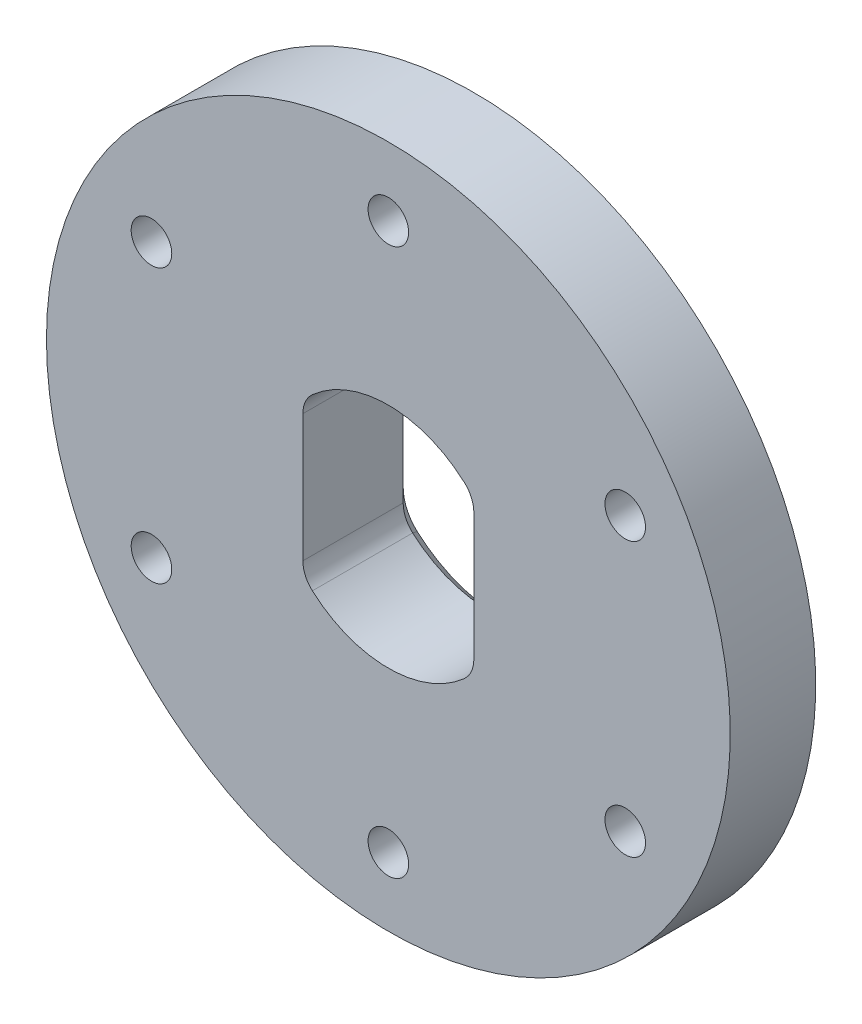
ISO-10303-21;
HEADER;
FILE_DESCRIPTION(('STEP AP214'),'2;1');
FILE_NAME('part.step','',(''),(''),'','','');
FILE_SCHEMA(('AUTOMOTIVE_DESIGN { 1 0 10303 214 1 1 1 1 }'));
ENDSEC;
DATA;
#1=APPLICATION_CONTEXT('core data for automotive mechanical design processes');
#2=APPLICATION_PROTOCOL_DEFINITION('international standard','automotive_design',2000,#1);
#3=PRODUCT_CONTEXT('',#1,'mechanical');
#4=PRODUCT('Part','Part','',(#3));
#5=PRODUCT_RELATED_PRODUCT_CATEGORY('part','',(#4));
#6=PRODUCT_DEFINITION_FORMATION('','',#4);
#7=PRODUCT_DEFINITION_CONTEXT('part definition',#1,'design');
#8=PRODUCT_DEFINITION('design','',#6,#7);
#9=PRODUCT_DEFINITION_SHAPE('','',#8);
#10=(LENGTH_UNIT() NAMED_UNIT(*) SI_UNIT(.MILLI.,.METRE.));
#11=(NAMED_UNIT(*) PLANE_ANGLE_UNIT() SI_UNIT($,.RADIAN.));
#12=(NAMED_UNIT(*) SI_UNIT($,.STERADIAN.) SOLID_ANGLE_UNIT());
#13=UNCERTAINTY_MEASURE_WITH_UNIT(LENGTH_MEASURE(1.E-05),#10,'distance_accuracy_value','');
#14=(GEOMETRIC_REPRESENTATION_CONTEXT(3) GLOBAL_UNCERTAINTY_ASSIGNED_CONTEXT((#13)) GLOBAL_UNIT_ASSIGNED_CONTEXT((#10,
#11,#12)) REPRESENTATION_CONTEXT('',''));
#15=CARTESIAN_POINT('',(0.,0.,0.));
#16=DIRECTION('',(0.,0.,1.));
#17=DIRECTION('',(1.,0.,0.));
#18=AXIS2_PLACEMENT_3D('',#15,#16,#17);
#19=CARTESIAN_POINT('',(0.,0.,0.));
#20=DIRECTION('',(0.,0.,1.));
#21=DIRECTION('',(1.,0.,0.));
#22=AXIS2_PLACEMENT_3D('',#19,#20,#21);
#23=PLANE('',#22);
#24=CARTESIAN_POINT('',(13.1982271536748,7.62000000000015,0.));
#25=DIRECTION('',(0.,0.,1.));
#26=DIRECTION('',(1.,0.,0.));
#27=AXIS2_PLACEMENT_3D('',#24,#25,#26);
#28=CIRCLE('',#27,1.13029999999999);
#29=CARTESIAN_POINT('',(14.3285271536747,7.62000000000015,0.));
#30=VERTEX_POINT('',#29);
#31=EDGE_CURVE('E233',#30,#30,#28,.T.);
#32=ORIENTED_EDGE('',*,*,#31,.T.);
#33=EDGE_LOOP('',(#32));
#34=FACE_BOUND('',#33,.T.);
#35=CARTESIAN_POINT('',(13.1982271536749,-7.61999999999988,0.));
#36=DIRECTION('',(0.,0.,1.));
#37=DIRECTION('',(1.,0.,0.));
#38=AXIS2_PLACEMENT_3D('',#35,#36,#37);
#39=CIRCLE('',#38,1.13029999999999);
#40=CARTESIAN_POINT('',(14.3285271536749,-7.61999999999988,0.));
#41=VERTEX_POINT('',#40);
#42=EDGE_CURVE('E243',#41,#41,#39,.T.);
#43=ORIENTED_EDGE('',*,*,#42,.T.);
#44=EDGE_LOOP('',(#43));
#45=FACE_BOUND('',#44,.T.);
#46=CARTESIAN_POINT('',(0.,-15.24,0.));
#47=DIRECTION('',(0.,0.,1.));
#48=DIRECTION('',(1.,0.,0.));
#49=AXIS2_PLACEMENT_3D('',#46,#47,#48);
#50=CIRCLE('',#49,1.13029999999999);
#51=CARTESIAN_POINT('',(1.13029999999999,-15.24,0.));
#52=VERTEX_POINT('',#51);
#53=EDGE_CURVE('E249',#52,#52,#50,.T.);
#54=ORIENTED_EDGE('',*,*,#53,.T.);
#55=EDGE_LOOP('',(#54));
#56=FACE_BOUND('',#55,.T.);
#57=CARTESIAN_POINT('',(-13.1982271536748,-7.62000000000006,0.));
#58=DIRECTION('',(0.,0.,1.));
#59=DIRECTION('',(1.,0.,0.));
#60=AXIS2_PLACEMENT_3D('',#57,#58,#59);
#61=CIRCLE('',#60,1.13029999999999);
#62=CARTESIAN_POINT('',(-12.0679271536748,-7.62000000000006,0.));
#63=VERTEX_POINT('',#62);
#64=EDGE_CURVE('E255',#63,#63,#61,.T.);
#65=ORIENTED_EDGE('',*,*,#64,.T.);
#66=EDGE_LOOP('',(#65));
#67=FACE_BOUND('',#66,.T.);
#68=CARTESIAN_POINT('',(-13.1982271536749,7.61999999999997,0.));
#69=DIRECTION('',(0.,0.,1.));
#70=DIRECTION('',(1.,0.,0.));
#71=AXIS2_PLACEMENT_3D('',#68,#69,#70);
#72=CIRCLE('',#71,1.13029999999999);
#73=CARTESIAN_POINT('',(-12.0679271536749,7.61999999999997,0.));
#74=VERTEX_POINT('',#73);
#75=EDGE_CURVE('E261',#74,#74,#72,.T.);
#76=ORIENTED_EDGE('',*,*,#75,.T.);
#77=EDGE_LOOP('',(#76));
#78=FACE_BOUND('',#77,.T.);
#79=CARTESIAN_POINT('',(0.,15.24,0.));
#80=DIRECTION('',(0.,0.,1.));
#81=DIRECTION('',(1.,0.,0.));
#82=AXIS2_PLACEMENT_3D('',#79,#80,#81);
#83=CIRCLE('',#82,1.13029999999999);
#84=CARTESIAN_POINT('',(1.13029999999999,15.24,0.));
#85=VERTEX_POINT('',#84);
#86=EDGE_CURVE('E267',#85,#85,#83,.T.);
#87=ORIENTED_EDGE('',*,*,#86,.T.);
#88=EDGE_LOOP('',(#87));
#89=FACE_BOUND('',#88,.T.);
#90=CARTESIAN_POINT('',(0.,0.,0.));
#91=DIRECTION('',(0.,0.,1.));
#92=DIRECTION('',(1.,0.,0.));
#93=AXIS2_PLACEMENT_3D('',#90,#91,#92);
#94=CIRCLE('',#93,12.7);
#95=CARTESIAN_POINT('',(12.7,0.,0.));
#96=VERTEX_POINT('',#95);
#97=EDGE_CURVE('E159',#96,#96,#94,.T.);
#98=ORIENTED_EDGE('',*,*,#97,.T.);
#99=EDGE_LOOP('',(#98));
#100=FACE_BOUND('',#99,.T.);
#101=CARTESIAN_POINT('',(0.,0.,0.));
#102=DIRECTION('',(0.,0.,1.));
#103=DIRECTION('',(1.,0.,0.));
#104=AXIS2_PLACEMENT_3D('',#101,#102,#103);
#105=CIRCLE('',#104,19.05);
#106=CARTESIAN_POINT('',(-19.05,0.,0.));
#107=VERTEX_POINT('',#106);
#108=EDGE_CURVE('E279',#107,#107,#105,.T.);
#109=ORIENTED_EDGE('',*,*,#108,.F.);
#110=EDGE_LOOP('',(#109));
#111=FACE_BOUND('',#110,.T.);
#112=ADVANCED_FACE('F37',(#34,#45,#56,#67,#78,#89,#100,#111),#23,.F.);
#113=CARTESIAN_POINT('',(0.,0.,4.7625));
#114=DIRECTION('',(0.,0.,-1.));
#115=DIRECTION('',(-1.,0.,0.));
#116=AXIS2_PLACEMENT_3D('',#113,#114,#115);
#117=CYLINDRICAL_SURFACE('',#116,19.05);
#118=CARTESIAN_POINT('',(0.,0.,4.7625));
#119=DIRECTION('',(0.,0.,1.));
#120=DIRECTION('',(1.,0.,0.));
#121=AXIS2_PLACEMENT_3D('',#118,#119,#120);
#122=CIRCLE('',#121,19.05);
#123=CARTESIAN_POINT('',(-19.05,0.,4.7625));
#124=VERTEX_POINT('',#123);
#125=EDGE_CURVE('E280',#124,#124,#122,.T.);
#126=CARTESIAN_POINT('',(-19.05,0.,4.7625));
#127=CARTESIAN_POINT('',(-19.05,0.,4.712890625));
#128=CARTESIAN_POINT('',(-19.05,0.,4.66328125));
#129=CARTESIAN_POINT('',(-19.05,0.,4.5640625));
#130=CARTESIAN_POINT('',(-19.05,0.,4.514453125));
#131=CARTESIAN_POINT('',(-19.05,0.,4.415234375));
#132=CARTESIAN_POINT('',(-19.05,0.,4.365625));
#133=CARTESIAN_POINT('',(-19.05,0.,4.26640625));
#134=CARTESIAN_POINT('',(-19.05,0.,4.216796875));
#135=CARTESIAN_POINT('',(-19.05,0.,4.117578125));
#136=CARTESIAN_POINT('',(-19.05,0.,4.06796875));
#137=CARTESIAN_POINT('',(-19.05,0.,3.96875));
#138=CARTESIAN_POINT('',(-19.05,0.,3.919140625));
#139=CARTESIAN_POINT('',(-19.05,0.,3.819921875));
#140=CARTESIAN_POINT('',(-19.05,0.,3.7703125));
#141=CARTESIAN_POINT('',(-19.05,0.,3.67109375));
#142=CARTESIAN_POINT('',(-19.05,0.,3.621484375));
#143=CARTESIAN_POINT('',(-19.05,0.,3.522265625));
#144=CARTESIAN_POINT('',(-19.05,0.,3.47265625));
#145=CARTESIAN_POINT('',(-19.05,0.,3.3734375));
#146=CARTESIAN_POINT('',(-19.05,0.,3.323828125));
#147=CARTESIAN_POINT('',(-19.05,0.,3.224609375));
#148=CARTESIAN_POINT('',(-19.05,0.,3.175));
#149=CARTESIAN_POINT('',(-19.05,0.,3.07578125));
#150=CARTESIAN_POINT('',(-19.05,0.,3.026171875));
#151=CARTESIAN_POINT('',(-19.05,0.,2.926953125));
#152=CARTESIAN_POINT('',(-19.05,0.,2.87734375));
#153=CARTESIAN_POINT('',(-19.05,0.,2.778125));
#154=CARTESIAN_POINT('',(-19.05,0.,2.728515625));
#155=CARTESIAN_POINT('',(-19.05,0.,2.629296875));
#156=CARTESIAN_POINT('',(-19.05,0.,2.5796875));
#157=CARTESIAN_POINT('',(-19.05,0.,2.48046875));
#158=CARTESIAN_POINT('',(-19.05,0.,2.430859375));
#159=CARTESIAN_POINT('',(-19.05,0.,2.331640625));
#160=CARTESIAN_POINT('',(-19.05,0.,2.28203125));
#161=CARTESIAN_POINT('',(-19.05,0.,2.1828125));
#162=CARTESIAN_POINT('',(-19.05,0.,2.133203125));
#163=CARTESIAN_POINT('',(-19.05,0.,2.033984375));
#164=CARTESIAN_POINT('',(-19.05,0.,1.984375));
#165=CARTESIAN_POINT('',(-19.05,0.,1.88515625));
#166=CARTESIAN_POINT('',(-19.05,0.,1.835546875));
#167=CARTESIAN_POINT('',(-19.05,0.,1.736328125));
#168=CARTESIAN_POINT('',(-19.05,0.,1.68671875));
#169=CARTESIAN_POINT('',(-19.05,0.,1.5875));
#170=CARTESIAN_POINT('',(-19.05,0.,1.537890625));
#171=CARTESIAN_POINT('',(-19.05,0.,1.438671875));
#172=CARTESIAN_POINT('',(-19.05,0.,1.3890625));
#173=CARTESIAN_POINT('',(-19.05,0.,1.28984375));
#174=CARTESIAN_POINT('',(-19.05,0.,1.240234375));
#175=CARTESIAN_POINT('',(-19.05,0.,1.141015625));
#176=CARTESIAN_POINT('',(-19.05,0.,1.09140625));
#177=CARTESIAN_POINT('',(-19.05,0.,0.992187499999999));
#178=CARTESIAN_POINT('',(-19.05,0.,0.942578124999999));
#179=CARTESIAN_POINT('',(-19.05,0.,0.843359375));
#180=CARTESIAN_POINT('',(-19.05,0.,0.79375));
#181=CARTESIAN_POINT('',(-19.05,0.,0.69453125));
#182=CARTESIAN_POINT('',(-19.05,0.,0.644921875));
#183=CARTESIAN_POINT('',(-19.05,0.,0.545703125));
#184=CARTESIAN_POINT('',(-19.05,0.,0.49609375));
#185=CARTESIAN_POINT('',(-19.05,0.,0.396875));
#186=CARTESIAN_POINT('',(-19.05,0.,0.347265625));
#187=CARTESIAN_POINT('',(-19.05,0.,0.248046875));
#188=CARTESIAN_POINT('',(-19.05,0.,0.1984375));
#189=CARTESIAN_POINT('',(-19.05,0.,0.09921875));
#190=CARTESIAN_POINT('',(-19.05,0.,0.049609375));
#191=CARTESIAN_POINT('',(-19.05,0.,0.));
#192=B_SPLINE_CURVE_WITH_KNOTS('',3,(#126,#127,#128,#129,#130,#131,#132,#133,#134,#135,#136,
#137,#138,#139,#140,#141,#142,#143,#144,#145,#146,#147,#148,#149,#150,#151,#152,#153,#154,#155,
#156,#157,#158,#159,#160,#161,#162,#163,#164,#165,#166,#167,#168,#169,#170,#171,#172,#173,#174,
#175,#176,#177,#178,#179,#180,#181,#182,#183,#184,#185,#186,#187,#188,#189,#190,#191),
.UNSPECIFIED.,.F.,.F.,(4,2,2,2,2,2,2,2,2,2,2,2,2,2,2,2,2,2,2,2,2,2,2,2,2,2,2,2,2,2,2,2,4),(0.,
0.148828125,0.29765625,0.446484375,0.5953125,0.744140625,0.892968750000001,1.041796875,1.190625,
1.339453125,1.48828125,1.637109375,1.7859375,1.934765625,2.08359375,2.232421875,2.38125,
2.530078125,2.67890625,2.827734375,2.9765625,3.125390625,3.27421875,3.423046875,3.571875,
3.720703125,3.86953125,4.018359375,4.1671875,4.316015625,4.46484375,4.613671875,4.7625),.UNSPECIFIED.);
#193=EDGE_CURVE('BSEAM305',#124,#107,#192,.T.);
#194=ORIENTED_EDGE('',*,*,#125,.F.);
#195=ORIENTED_EDGE('',*,*,#108,.T.);
#196=ORIENTED_EDGE('',*,*,#193,.T.);
#197=ORIENTED_EDGE('',*,*,#193,.F.);
#198=EDGE_LOOP('',(#194,#196,#195,#197));
#199=FACE_BOUND('',#198,.T.);
#200=ADVANCED_FACE('F305',(#199),#117,.T.);
#201=CARTESIAN_POINT('',(0.,0.,4.7625));
#202=DIRECTION('',(0.,0.,1.));
#203=DIRECTION('',(1.,0.,0.));
#204=AXIS2_PLACEMENT_3D('',#201,#202,#203);
#205=PLANE('',#204);
#206=CARTESIAN_POINT('',(13.1982271536748,7.62000000000015,4.7625));
#207=DIRECTION('',(0.,0.,1.));
#208=DIRECTION('',(1.,0.,0.));
#209=AXIS2_PLACEMENT_3D('',#206,#207,#208);
#210=CIRCLE('',#209,1.13029999999999);
#211=CARTESIAN_POINT('',(14.3285271536747,7.62000000000015,4.7625));
#212=VERTEX_POINT('',#211);
#213=EDGE_CURVE('E227',#212,#212,#210,.T.);
#214=ORIENTED_EDGE('',*,*,#213,.F.);
#215=EDGE_LOOP('',(#214));
#216=FACE_BOUND('',#215,.T.);
#217=CARTESIAN_POINT('',(13.1982271536749,-7.61999999999988,4.7625));
#218=DIRECTION('',(0.,0.,1.));
#219=DIRECTION('',(1.,0.,0.));
#220=AXIS2_PLACEMENT_3D('',#217,#218,#219);
#221=CIRCLE('',#220,1.13029999999999);
#222=CARTESIAN_POINT('',(14.3285271536749,-7.61999999999988,4.7625));
#223=VERTEX_POINT('',#222);
#224=EDGE_CURVE('E238',#223,#223,#221,.T.);
#225=ORIENTED_EDGE('',*,*,#224,.F.);
#226=EDGE_LOOP('',(#225));
#227=FACE_BOUND('',#226,.T.);
#228=CARTESIAN_POINT('',(0.,-15.24,4.7625));
#229=DIRECTION('',(0.,0.,1.));
#230=DIRECTION('',(1.,0.,0.));
#231=AXIS2_PLACEMENT_3D('',#228,#229,#230);
#232=CIRCLE('',#231,1.13029999999999);
#233=CARTESIAN_POINT('',(1.13029999999999,-15.24,4.7625));
#234=VERTEX_POINT('',#233);
#235=EDGE_CURVE('E246',#234,#234,#232,.T.);
#236=ORIENTED_EDGE('',*,*,#235,.F.);
#237=EDGE_LOOP('',(#236));
#238=FACE_BOUND('',#237,.T.);
#239=CARTESIAN_POINT('',(-13.1982271536748,-7.62000000000006,4.7625));
#240=DIRECTION('',(0.,0.,1.));
#241=DIRECTION('',(1.,0.,0.));
#242=AXIS2_PLACEMENT_3D('',#239,#240,#241);
#243=CIRCLE('',#242,1.13029999999999);
#244=CARTESIAN_POINT('',(-12.0679271536748,-7.62000000000006,4.7625));
#245=VERTEX_POINT('',#244);
#246=EDGE_CURVE('E252',#245,#245,#243,.T.);
#247=ORIENTED_EDGE('',*,*,#246,.F.);
#248=EDGE_LOOP('',(#247));
#249=FACE_BOUND('',#248,.T.);
#250=CARTESIAN_POINT('',(-13.1982271536749,7.61999999999997,4.7625));
#251=DIRECTION('',(0.,0.,1.));
#252=DIRECTION('',(1.,0.,0.));
#253=AXIS2_PLACEMENT_3D('',#250,#251,#252);
#254=CIRCLE('',#253,1.13029999999999);
#255=CARTESIAN_POINT('',(-12.0679271536749,7.61999999999997,4.7625));
#256=VERTEX_POINT('',#255);
#257=EDGE_CURVE('E258',#256,#256,#254,.T.);
#258=ORIENTED_EDGE('',*,*,#257,.F.);
#259=EDGE_LOOP('',(#258));
#260=FACE_BOUND('',#259,.T.);
#261=CARTESIAN_POINT('',(0.,15.24,4.7625));
#262=DIRECTION('',(0.,0.,1.));
#263=DIRECTION('',(1.,0.,0.));
#264=AXIS2_PLACEMENT_3D('',#261,#262,#263);
#265=CIRCLE('',#264,1.13029999999999);
#266=CARTESIAN_POINT('',(1.13029999999999,15.24,4.7625));
#267=VERTEX_POINT('',#266);
#268=EDGE_CURVE('E264',#267,#267,#265,.T.);
#269=ORIENTED_EDGE('',*,*,#268,.F.);
#270=EDGE_LOOP('',(#269));
#271=FACE_BOUND('',#270,.T.);
#272=DIRECTION('',(0.,1.,0.));
#273=VECTOR('',#272,1.);
#274=CARTESIAN_POINT('',(-4.7625,4.20013020631504,4.7625));
#275=LINE('',#274,#273);
#276=CARTESIAN_POINT('',(-4.7625,-3.54975791428091,4.7625));
#277=VERTEX_POINT('',#276);
#278=CARTESIAN_POINT('',(-4.7625,3.54975791428092,4.7625));
#279=VERTEX_POINT('',#278);
#280=EDGE_CURVE('E133',#277,#279,#275,.T.);
#281=ORIENTED_EDGE('',*,*,#280,.T.);
#282=CARTESIAN_POINT('',(-3.175,3.54975791428092,4.7625));
#283=DIRECTION('',(0.,0.,1.));
#284=DIRECTION('',(1.,0.,0.));
#285=AXIS2_PLACEMENT_3D('',#282,#283,#284);
#286=CIRCLE('',#285,1.5875);
#287=CARTESIAN_POINT('',(-4.23333333333333,4.73301055237455,4.7625));
#288=VERTEX_POINT('',#287);
#289=EDGE_CURVE('E173',#279,#288,#286,.F.);
#290=ORIENTED_EDGE('',*,*,#289,.T.);
#291=CARTESIAN_POINT('',(0.,0.,4.7625));
#292=DIRECTION('',(0.,0.,-1.));
#293=DIRECTION('',(-1.,0.,0.));
#294=AXIS2_PLACEMENT_3D('',#291,#292,#293);
#295=CIRCLE('',#294,6.35);
#296=CARTESIAN_POINT('',(4.23333333333333,4.73301055237456,4.7625));
#297=VERTEX_POINT('',#296);
#298=EDGE_CURVE('E270',#288,#297,#295,.T.);
#299=ORIENTED_EDGE('',*,*,#298,.T.);
#300=CARTESIAN_POINT('',(3.175,3.54975791428092,4.7625));
#301=DIRECTION('',(0.,0.,1.));
#302=DIRECTION('',(1.,0.,0.));
#303=AXIS2_PLACEMENT_3D('',#300,#301,#302);
#304=CIRCLE('',#303,1.5875);
#305=CARTESIAN_POINT('',(4.7625,3.54975791428092,4.7625));
#306=VERTEX_POINT('',#305);
#307=EDGE_CURVE('E175',#297,#306,#304,.F.);
#308=ORIENTED_EDGE('',*,*,#307,.T.);
#309=DIRECTION('',(0.,-1.,0.));
#310=VECTOR('',#309,1.);
#311=CARTESIAN_POINT('',(4.7625,4.20013020631504,4.7625));
#312=LINE('',#311,#310);
#313=CARTESIAN_POINT('',(4.7625,-3.54975791428092,4.7625));
#314=VERTEX_POINT('',#313);
#315=EDGE_CURVE('E273',#306,#314,#312,.T.);
#316=ORIENTED_EDGE('',*,*,#315,.T.);
#317=CARTESIAN_POINT('',(3.175,-3.54975791428092,4.7625));
#318=DIRECTION('',(0.,0.,1.));
#319=DIRECTION('',(1.,0.,0.));
#320=AXIS2_PLACEMENT_3D('',#317,#318,#319);
#321=CIRCLE('',#320,1.5875);
#322=CARTESIAN_POINT('',(4.23333333333333,-4.73301055237456,4.7625));
#323=VERTEX_POINT('',#322);
#324=EDGE_CURVE('E140',#314,#323,#321,.F.);
#325=ORIENTED_EDGE('',*,*,#324,.T.);
#326=CARTESIAN_POINT('',(0.,0.,4.7625));
#327=DIRECTION('',(0.,0.,-1.));
#328=DIRECTION('',(-1.,0.,0.));
#329=AXIS2_PLACEMENT_3D('',#326,#327,#328);
#330=CIRCLE('',#329,6.35);
#331=CARTESIAN_POINT('',(-4.23333333333333,-4.73301055237455,4.7625));
#332=VERTEX_POINT('',#331);
#333=EDGE_CURVE('E136',#323,#332,#330,.T.);
#334=ORIENTED_EDGE('',*,*,#333,.T.);
#335=CARTESIAN_POINT('',(-3.175,-3.54975791428092,4.7625));
#336=DIRECTION('',(0.,0.,1.));
#337=DIRECTION('',(1.,0.,0.));
#338=AXIS2_PLACEMENT_3D('',#335,#336,#337);
#339=CIRCLE('',#338,1.5875);
#340=EDGE_CURVE('E129',#332,#277,#339,.F.);
#341=ORIENTED_EDGE('',*,*,#340,.T.);
#342=EDGE_LOOP('',(#281,#290,#299,#308,#316,#325,#334,#341));
#343=FACE_BOUND('',#342,.T.);
#344=ORIENTED_EDGE('',*,*,#125,.T.);
#345=EDGE_LOOP('',(#344));
#346=FACE_BOUND('',#345,.T.);
#347=ADVANCED_FACE('F131',(#216,#227,#238,#249,#260,#271,#343,#346),#205,.T.);
#348=CARTESIAN_POINT('',(0.,0.,-1.5875));
#349=DIRECTION('',(0.,0.,-1.));
#350=DIRECTION('',(-1.,0.,0.));
#351=AXIS2_PLACEMENT_3D('',#348,#349,#350);
#352=PLANE('',#351);
#353=CARTESIAN_POINT('',(-3.175,-3.54975791428092,-1.5875));
#354=DIRECTION('',(0.,0.,-1.));
#355=DIRECTION('',(-1.,0.,0.));
#356=AXIS2_PLACEMENT_3D('',#353,#354,#355);
#357=CIRCLE('',#356,2.34950000000001);
#358=CARTESIAN_POINT('',(-5.52450000000001,-3.54975791428092,-1.5875));
#359=VERTEX_POINT('',#358);
#360=CARTESIAN_POINT('',(-4.74133333333334,-5.30097181865951,-1.5875));
#361=VERTEX_POINT('',#360);
#362=EDGE_CURVE('E192',#359,#361,#357,.F.);
#363=ORIENTED_EDGE('',*,*,#362,.T.);
#364=CARTESIAN_POINT('',(0.,0.,-1.5875));
#365=DIRECTION('',(0.,0.,-1.));
#366=DIRECTION('',(-1.,0.,0.));
#367=AXIS2_PLACEMENT_3D('',#364,#365,#366);
#368=CIRCLE('',#367,7.11200000000001);
#369=CARTESIAN_POINT('',(4.74133333333334,-5.30097181865951,-1.5875));
#370=VERTEX_POINT('',#369);
#371=EDGE_CURVE('E194',#361,#370,#368,.F.);
#372=ORIENTED_EDGE('',*,*,#371,.T.);
#373=CARTESIAN_POINT('',(3.175,-3.54975791428092,-1.5875));
#374=DIRECTION('',(0.,0.,-1.));
#375=DIRECTION('',(-1.,0.,0.));
#376=AXIS2_PLACEMENT_3D('',#373,#374,#375);
#377=CIRCLE('',#376,2.34950000000001);
#378=CARTESIAN_POINT('',(5.52450000000001,-3.54975791428092,-1.5875));
#379=VERTEX_POINT('',#378);
#380=EDGE_CURVE('E190',#370,#379,#377,.F.);
#381=ORIENTED_EDGE('',*,*,#380,.T.);
#382=DIRECTION('',(0.,1.,0.));
#383=VECTOR('',#382,1.);
#384=CARTESIAN_POINT('',(5.52450000000001,3.54975791428092,-1.5875));
#385=LINE('',#384,#383);
#386=CARTESIAN_POINT('',(5.52450000000001,3.54975791428092,-1.5875));
#387=VERTEX_POINT('',#386);
#388=EDGE_CURVE('E186',#379,#387,#385,.T.);
#389=ORIENTED_EDGE('',*,*,#388,.T.);
#390=CARTESIAN_POINT('',(3.175,3.54975791428092,-1.5875));
#391=DIRECTION('',(0.,0.,-1.));
#392=DIRECTION('',(-1.,0.,0.));
#393=AXIS2_PLACEMENT_3D('',#390,#391,#392);
#394=CIRCLE('',#393,2.34950000000001);
#395=CARTESIAN_POINT('',(4.74133333333334,5.30097181865951,-1.5875));
#396=VERTEX_POINT('',#395);
#397=EDGE_CURVE('E182',#387,#396,#394,.F.);
#398=ORIENTED_EDGE('',*,*,#397,.T.);
#399=CARTESIAN_POINT('',(0.,0.,-1.5875));
#400=DIRECTION('',(0.,0.,-1.));
#401=DIRECTION('',(-1.,0.,0.));
#402=AXIS2_PLACEMENT_3D('',#399,#400,#401);
#403=CIRCLE('',#402,7.11200000000001);
#404=CARTESIAN_POINT('',(-4.74133333333334,5.30097181865951,-1.5875));
#405=VERTEX_POINT('',#404);
#406=EDGE_CURVE('E180',#396,#405,#403,.F.);
#407=ORIENTED_EDGE('',*,*,#406,.T.);
#408=CARTESIAN_POINT('',(-3.175,3.54975791428092,-1.5875));
#409=DIRECTION('',(0.,0.,-1.));
#410=DIRECTION('',(-1.,0.,0.));
#411=AXIS2_PLACEMENT_3D('',#408,#409,#410);
#412=CIRCLE('',#411,2.34950000000001);
#413=CARTESIAN_POINT('',(-5.52450000000001,3.54975791428092,-1.5875));
#414=VERTEX_POINT('',#413);
#415=EDGE_CURVE('E184',#405,#414,#412,.F.);
#416=ORIENTED_EDGE('',*,*,#415,.T.);
#417=DIRECTION('',(0.,-1.,0.));
#418=VECTOR('',#417,1.);
#419=CARTESIAN_POINT('',(-5.52450000000001,-3.54975791428091,-1.5875));
#420=LINE('',#419,#418);
#421=EDGE_CURVE('E188',#414,#359,#420,.T.);
#422=ORIENTED_EDGE('',*,*,#421,.T.);
#423=EDGE_LOOP('',(#363,#372,#381,#389,#398,#407,#416,#422));
#424=FACE_BOUND('',#423,.T.);
#425=CARTESIAN_POINT('',(0.,0.,-1.5875));
#426=DIRECTION('',(0.,0.,-1.));
#427=DIRECTION('',(-1.,0.,0.));
#428=AXIS2_PLACEMENT_3D('',#425,#426,#427);
#429=CIRCLE('',#428,11.1125);
#430=CARTESIAN_POINT('',(-11.1125,0.,-1.5875));
#431=VERTEX_POINT('',#430);
#432=EDGE_CURVE('E149',#431,#431,#429,.T.);
#433=ORIENTED_EDGE('',*,*,#432,.T.);
#434=EDGE_LOOP('',(#433));
#435=FACE_BOUND('',#434,.T.);
#436=ADVANCED_FACE('F293',(#424,#435),#352,.T.);
#437=CARTESIAN_POINT('',(0.,0.,-1.5875));
#438=DIRECTION('',(0.,0.,1.));
#439=DIRECTION('',(1.,0.,0.));
#440=AXIS2_PLACEMENT_3D('',#437,#438,#439);
#441=TOROIDAL_SURFACE('',#440,12.7,1.5875);
#442=ORIENTED_EDGE('',*,*,#97,.F.);
#443=EDGE_LOOP('',(#442));
#444=FACE_BOUND('',#443,.T.);
#445=ORIENTED_EDGE('',*,*,#432,.F.);
#446=EDGE_LOOP('',(#445));
#447=FACE_BOUND('',#446,.T.);
#448=ADVANCED_FACE('F289',(#444,#447),#441,.F.);
#449=CARTESIAN_POINT('',(0.,0.,4.7625));
#450=DIRECTION('',(0.,0.,-1.));
#451=DIRECTION('',(-1.,0.,0.));
#452=AXIS2_PLACEMENT_3D('',#449,#450,#451);
#453=CYLINDRICAL_SURFACE('',#452,6.35);
#454=DIRECTION('',(0.,0.,-1.));
#455=VECTOR('',#454,1.);
#456=CARTESIAN_POINT('',(-4.23333333333333,4.73301055237455,4.7625));
#457=LINE('',#456,#455);
#458=CARTESIAN_POINT('',(-4.23333333333333,4.73301055237455,-0.825499999999991));
#459=VERTEX_POINT('',#458);
#460=EDGE_CURVE('E141',#288,#459,#457,.T.);
#461=ORIENTED_EDGE('',*,*,#460,.T.);
#462=CARTESIAN_POINT('',(0.,0.,-0.825499999999991));
#463=DIRECTION('',(0.,0.,-1.));
#464=DIRECTION('',(-1.,0.,0.));
#465=AXIS2_PLACEMENT_3D('',#462,#463,#464);
#466=CIRCLE('',#465,6.35);
#467=CARTESIAN_POINT('',(4.23333333333333,4.73301055237456,-0.825499999999991));
#468=VERTEX_POINT('',#467);
#469=EDGE_CURVE('E11',#459,#468,#466,.T.);
#470=ORIENTED_EDGE('',*,*,#469,.T.);
#471=DIRECTION('',(0.,0.,-1.));
#472=VECTOR('',#471,1.);
#473=CARTESIAN_POINT('',(4.23333333333333,4.73301055237456,4.7625));
#474=LINE('',#473,#472);
#475=EDGE_CURVE('E169',#468,#297,#474,.F.);
#476=ORIENTED_EDGE('',*,*,#475,.T.);
#477=ORIENTED_EDGE('',*,*,#298,.F.);
#478=EDGE_LOOP('',(#461,#470,#476,#477));
#479=FACE_BOUND('',#478,.T.);
#480=ADVANCED_FACE('F292',(#479),#453,.F.);
#481=CARTESIAN_POINT('',(-4.7625,4.20013020631504,4.7625));
#482=DIRECTION('',(-1.,0.,0.));
#483=DIRECTION('',(0.,0.,1.));
#484=AXIS2_PLACEMENT_3D('',#481,#482,#483);
#485=PLANE('',#484);
#486=DIRECTION('',(0.,0.,1.));
#487=VECTOR('',#486,1.);
#488=CARTESIAN_POINT('',(-4.7625,-3.54975791428092,-1.5875));
#489=LINE('',#488,#487);
#490=CARTESIAN_POINT('',(-4.7625,-3.54975791428092,-0.825499999999991));
#491=VERTEX_POINT('',#490);
#492=EDGE_CURVE('E146',#277,#491,#489,.F.);
#493=ORIENTED_EDGE('',*,*,#492,.T.);
#494=DIRECTION('',(0.,1.,0.));
#495=VECTOR('',#494,1.);
#496=CARTESIAN_POINT('',(-4.7625,3.54975791428092,-0.825499999999991));
#497=LINE('',#496,#495);
#498=CARTESIAN_POINT('',(-4.7625,3.54975791428092,-0.825499999999991));
#499=VERTEX_POINT('',#498);
#500=EDGE_CURVE('E200',#491,#499,#497,.T.);
#501=ORIENTED_EDGE('',*,*,#500,.T.);
#502=DIRECTION('',(0.,0.,1.));
#503=VECTOR('',#502,1.);
#504=CARTESIAN_POINT('',(-4.7625,3.54975791428092,4.7625));
#505=LINE('',#504,#503);
#506=EDGE_CURVE('E148',#499,#279,#505,.T.);
#507=ORIENTED_EDGE('',*,*,#506,.T.);
#508=ORIENTED_EDGE('',*,*,#280,.F.);
#509=EDGE_LOOP('',(#493,#501,#507,#508));
#510=FACE_BOUND('',#509,.T.);
#511=ADVANCED_FACE('F145',(#510),#485,.F.);
#512=CARTESIAN_POINT('',(0.,0.,4.7625));
#513=DIRECTION('',(0.,0.,-1.));
#514=DIRECTION('',(-1.,0.,0.));
#515=AXIS2_PLACEMENT_3D('',#512,#513,#514);
#516=CYLINDRICAL_SURFACE('',#515,6.35);
#517=DIRECTION('',(0.,0.,-1.));
#518=VECTOR('',#517,1.);
#519=CARTESIAN_POINT('',(4.23333333333333,-4.73301055237456,4.7625));
#520=LINE('',#519,#518);
#521=CARTESIAN_POINT('',(4.23333333333333,-4.73301055237456,-0.825499999999991));
#522=VERTEX_POINT('',#521);
#523=EDGE_CURVE('E154',#323,#522,#520,.T.);
#524=ORIENTED_EDGE('',*,*,#523,.T.);
#525=CARTESIAN_POINT('',(0.,0.,-0.825499999999991));
#526=DIRECTION('',(0.,0.,-1.));
#527=DIRECTION('',(-1.,0.,0.));
#528=AXIS2_PLACEMENT_3D('',#525,#526,#527);
#529=CIRCLE('',#528,6.35);
#530=CARTESIAN_POINT('',(-4.23333333333333,-4.73301055237455,-0.825499999999991));
#531=VERTEX_POINT('',#530);
#532=EDGE_CURVE('E177',#522,#531,#529,.T.);
#533=ORIENTED_EDGE('',*,*,#532,.T.);
#534=DIRECTION('',(0.,0.,-1.));
#535=VECTOR('',#534,1.);
#536=CARTESIAN_POINT('',(-4.23333333333333,-4.73301055237455,4.7625));
#537=LINE('',#536,#535);
#538=EDGE_CURVE('E157',#531,#332,#537,.F.);
#539=ORIENTED_EDGE('',*,*,#538,.T.);
#540=ORIENTED_EDGE('',*,*,#333,.F.);
#541=EDGE_LOOP('',(#524,#533,#539,#540));
#542=FACE_BOUND('',#541,.T.);
#543=ADVANCED_FACE('F385',(#542),#516,.F.);
#544=CARTESIAN_POINT('',(4.7625,4.20013020631504,4.7625));
#545=DIRECTION('',(1.,0.,0.));
#546=DIRECTION('',(0.,0.,-1.));
#547=AXIS2_PLACEMENT_3D('',#544,#545,#546);
#548=PLANE('',#547);
#549=DIRECTION('',(0.,0.,1.));
#550=VECTOR('',#549,1.);
#551=CARTESIAN_POINT('',(4.7625,3.54975791428092,-1.5875));
#552=LINE('',#551,#550);
#553=CARTESIAN_POINT('',(4.7625,3.54975791428092,-0.825499999999991));
#554=VERTEX_POINT('',#553);
#555=EDGE_CURVE('E164',#306,#554,#552,.F.);
#556=ORIENTED_EDGE('',*,*,#555,.T.);
#557=DIRECTION('',(0.,-1.,0.));
#558=VECTOR('',#557,1.);
#559=CARTESIAN_POINT('',(4.7625,-3.54975791428092,-0.825499999999991));
#560=LINE('',#559,#558);
#561=CARTESIAN_POINT('',(4.7625,-3.54975791428092,-0.825499999999991));
#562=VERTEX_POINT('',#561);
#563=EDGE_CURVE('E202',#554,#562,#560,.T.);
#564=ORIENTED_EDGE('',*,*,#563,.T.);
#565=DIRECTION('',(0.,0.,1.));
#566=VECTOR('',#565,1.);
#567=CARTESIAN_POINT('',(4.7625,-3.54975791428092,4.7625));
#568=LINE('',#567,#566);
#569=EDGE_CURVE('E167',#562,#314,#568,.T.);
#570=ORIENTED_EDGE('',*,*,#569,.T.);
#571=ORIENTED_EDGE('',*,*,#315,.F.);
#572=EDGE_LOOP('',(#556,#564,#570,#571));
#573=FACE_BOUND('',#572,.T.);
#574=ADVANCED_FACE('F322',(#573),#548,.F.);
#575=CARTESIAN_POINT('',(-3.175,-3.54975791428092,4.7625));
#576=DIRECTION('',(0.,0.,-1.));
#577=DIRECTION('',(-1.,0.,0.));
#578=AXIS2_PLACEMENT_3D('',#575,#576,#577);
#579=CYLINDRICAL_SURFACE('',#578,1.5875);
#580=ORIENTED_EDGE('',*,*,#538,.F.);
#581=CARTESIAN_POINT('',(-3.175,-3.54975791428092,-0.825499999999991));
#582=DIRECTION('',(0.,0.,-1.));
#583=DIRECTION('',(-1.,0.,0.));
#584=AXIS2_PLACEMENT_3D('',#581,#582,#583);
#585=CIRCLE('',#584,1.5875);
#586=EDGE_CURVE('E153',#531,#491,#585,.T.);
#587=ORIENTED_EDGE('',*,*,#586,.T.);
#588=ORIENTED_EDGE('',*,*,#492,.F.);
#589=ORIENTED_EDGE('',*,*,#340,.F.);
#590=EDGE_LOOP('',(#580,#587,#588,#589));
#591=FACE_BOUND('',#590,.T.);
#592=ADVANCED_FACE('F151',(#591),#579,.F.);
#593=CARTESIAN_POINT('',(3.175,-3.54975791428092,4.7625));
#594=DIRECTION('',(0.,0.,-1.));
#595=DIRECTION('',(-1.,0.,0.));
#596=AXIS2_PLACEMENT_3D('',#593,#594,#595);
#597=CYLINDRICAL_SURFACE('',#596,1.5875);
#598=ORIENTED_EDGE('',*,*,#569,.F.);
#599=CARTESIAN_POINT('',(3.175,-3.54975791428092,-0.825499999999991));
#600=DIRECTION('',(0.,0.,-1.));
#601=DIRECTION('',(-1.,0.,0.));
#602=AXIS2_PLACEMENT_3D('',#599,#600,#601);
#603=CIRCLE('',#602,1.5875);
#604=EDGE_CURVE('E198',#562,#522,#603,.T.);
#605=ORIENTED_EDGE('',*,*,#604,.T.);
#606=ORIENTED_EDGE('',*,*,#523,.F.);
#607=ORIENTED_EDGE('',*,*,#324,.F.);
#608=EDGE_LOOP('',(#598,#605,#606,#607));
#609=FACE_BOUND('',#608,.T.);
#610=ADVANCED_FACE('F321',(#609),#597,.F.);
#611=CARTESIAN_POINT('',(-3.175,3.54975791428092,4.7625));
#612=DIRECTION('',(0.,0.,-1.));
#613=DIRECTION('',(-1.,0.,0.));
#614=AXIS2_PLACEMENT_3D('',#611,#612,#613);
#615=CYLINDRICAL_SURFACE('',#614,1.5875);
#616=ORIENTED_EDGE('',*,*,#506,.F.);
#617=CARTESIAN_POINT('',(-3.175,3.54975791428092,-0.825499999999991));
#618=DIRECTION('',(0.,0.,-1.));
#619=DIRECTION('',(-1.,0.,0.));
#620=AXIS2_PLACEMENT_3D('',#617,#618,#619);
#621=CIRCLE('',#620,1.5875);
#622=EDGE_CURVE('E60',#499,#459,#621,.T.);
#623=ORIENTED_EDGE('',*,*,#622,.T.);
#624=ORIENTED_EDGE('',*,*,#460,.F.);
#625=ORIENTED_EDGE('',*,*,#289,.F.);
#626=EDGE_LOOP('',(#616,#623,#624,#625));
#627=FACE_BOUND('',#626,.T.);
#628=ADVANCED_FACE('F325',(#627),#615,.F.);
#629=CARTESIAN_POINT('',(3.175,3.54975791428092,4.7625));
#630=DIRECTION('',(0.,0.,-1.));
#631=DIRECTION('',(-1.,0.,0.));
#632=AXIS2_PLACEMENT_3D('',#629,#630,#631);
#633=CYLINDRICAL_SURFACE('',#632,1.5875);
#634=ORIENTED_EDGE('',*,*,#475,.F.);
#635=CARTESIAN_POINT('',(3.175,3.54975791428092,-0.825499999999991));
#636=DIRECTION('',(0.,0.,-1.));
#637=DIRECTION('',(-1.,0.,0.));
#638=AXIS2_PLACEMENT_3D('',#635,#636,#637);
#639=CIRCLE('',#638,1.5875);
#640=EDGE_CURVE('E46',#468,#554,#639,.T.);
#641=ORIENTED_EDGE('',*,*,#640,.T.);
#642=ORIENTED_EDGE('',*,*,#555,.F.);
#643=ORIENTED_EDGE('',*,*,#307,.F.);
#644=EDGE_LOOP('',(#634,#641,#642,#643));
#645=FACE_BOUND('',#644,.T.);
#646=ADVANCED_FACE('F329',(#645),#633,.F.);
#647=CARTESIAN_POINT('',(0.,15.24,4.7625));
#648=DIRECTION('',(0.,0.,1.));
#649=DIRECTION('',(1.,0.,0.));
#650=AXIS2_PLACEMENT_3D('',#647,#648,#649);
#651=CYLINDRICAL_SURFACE('',#650,1.13029999999999);
#652=ORIENTED_EDGE('',*,*,#86,.F.);
#653=EDGE_LOOP('',(#652));
#654=FACE_BOUND('',#653,.T.);
#655=ORIENTED_EDGE('',*,*,#268,.T.);
#656=EDGE_LOOP('',(#655));
#657=FACE_BOUND('',#656,.T.);
#658=ADVANCED_FACE('F332',(#654,#657),#651,.F.);
#659=CARTESIAN_POINT('',(-13.1982271536749,7.61999999999997,4.7625));
#660=DIRECTION('',(0.,0.,1.));
#661=DIRECTION('',(1.,0.,0.));
#662=AXIS2_PLACEMENT_3D('',#659,#660,#661);
#663=CYLINDRICAL_SURFACE('',#662,1.13029999999999);
#664=ORIENTED_EDGE('',*,*,#75,.F.);
#665=EDGE_LOOP('',(#664));
#666=FACE_BOUND('',#665,.T.);
#667=ORIENTED_EDGE('',*,*,#257,.T.);
#668=EDGE_LOOP('',(#667));
#669=FACE_BOUND('',#668,.T.);
#670=ADVANCED_FACE('F405',(#666,#669),#663,.F.);
#671=CARTESIAN_POINT('',(-13.1982271536748,-7.62000000000006,4.7625));
#672=DIRECTION('',(0.,0.,1.));
#673=DIRECTION('',(1.,0.,0.));
#674=AXIS2_PLACEMENT_3D('',#671,#672,#673);
#675=CYLINDRICAL_SURFACE('',#674,1.13029999999999);
#676=ORIENTED_EDGE('',*,*,#64,.F.);
#677=EDGE_LOOP('',(#676));
#678=FACE_BOUND('',#677,.T.);
#679=ORIENTED_EDGE('',*,*,#246,.T.);
#680=EDGE_LOOP('',(#679));
#681=FACE_BOUND('',#680,.T.);
#682=ADVANCED_FACE('F409',(#678,#681),#675,.F.);
#683=CARTESIAN_POINT('',(0.,-15.24,4.7625));
#684=DIRECTION('',(0.,0.,1.));
#685=DIRECTION('',(1.,0.,0.));
#686=AXIS2_PLACEMENT_3D('',#683,#684,#685);
#687=CYLINDRICAL_SURFACE('',#686,1.13029999999999);
#688=ORIENTED_EDGE('',*,*,#53,.F.);
#689=EDGE_LOOP('',(#688));
#690=FACE_BOUND('',#689,.T.);
#691=ORIENTED_EDGE('',*,*,#235,.T.);
#692=EDGE_LOOP('',(#691));
#693=FACE_BOUND('',#692,.T.);
#694=ADVANCED_FACE('F413',(#690,#693),#687,.F.);
#695=CARTESIAN_POINT('',(13.1982271536749,-7.61999999999988,4.7625));
#696=DIRECTION('',(0.,0.,1.));
#697=DIRECTION('',(1.,0.,0.));
#698=AXIS2_PLACEMENT_3D('',#695,#696,#697);
#699=CYLINDRICAL_SURFACE('',#698,1.13029999999999);
#700=ORIENTED_EDGE('',*,*,#42,.F.);
#701=EDGE_LOOP('',(#700));
#702=FACE_BOUND('',#701,.T.);
#703=ORIENTED_EDGE('',*,*,#224,.T.);
#704=EDGE_LOOP('',(#703));
#705=FACE_BOUND('',#704,.T.);
#706=ADVANCED_FACE('F366',(#702,#705),#699,.F.);
#707=CARTESIAN_POINT('',(13.1982271536748,7.62000000000015,4.7625));
#708=DIRECTION('',(0.,0.,1.));
#709=DIRECTION('',(1.,0.,0.));
#710=AXIS2_PLACEMENT_3D('',#707,#708,#709);
#711=CYLINDRICAL_SURFACE('',#710,1.13029999999999);
#712=ORIENTED_EDGE('',*,*,#31,.F.);
#713=EDGE_LOOP('',(#712));
#714=FACE_BOUND('',#713,.T.);
#715=ORIENTED_EDGE('',*,*,#213,.T.);
#716=EDGE_LOOP('',(#715));
#717=FACE_BOUND('',#716,.T.);
#718=ADVANCED_FACE('F361',(#714,#717),#711,.F.);
#719=CARTESIAN_POINT('',(0.,0.,-0.825499999999991));
#720=DIRECTION('',(0.,0.,-1.));
#721=DIRECTION('',(-1.,0.,0.));
#722=AXIS2_PLACEMENT_3D('',#719,#720,#721);
#723=CONICAL_SURFACE('',#722,6.35,0.785398163397447);
#724=DIRECTION('',(0.471404520791031,-0.527046276694729,0.707106781186548));
#725=VECTOR('',#724,1.);
#726=CARTESIAN_POINT('',(-4.74133333333334,5.30097181865951,-1.5875));
#727=LINE('',#726,#725);
#728=EDGE_CURVE('E221',#405,#459,#727,.T.);
#729=ORIENTED_EDGE('',*,*,#728,.F.);
#730=ORIENTED_EDGE('',*,*,#406,.F.);
#731=DIRECTION('',(0.471404520791031,0.527046276694729,-0.707106781186548));
#732=VECTOR('',#731,1.);
#733=CARTESIAN_POINT('',(4.23333333333333,4.73301055237456,-0.825499999999991));
#734=LINE('',#733,#732);
#735=EDGE_CURVE('E41',#468,#396,#734,.T.);
#736=ORIENTED_EDGE('',*,*,#735,.F.);
#737=ORIENTED_EDGE('',*,*,#469,.F.);
#738=EDGE_LOOP('',(#729,#730,#736,#737));
#739=FACE_BOUND('',#738,.T.);
#740=ADVANCED_FACE('F39',(#739),#723,.F.);
#741=CARTESIAN_POINT('',(3.175,3.54975791428092,-1.5875));
#742=DIRECTION('',(0.,0.,-1.));
#743=DIRECTION('',(-1.,0.,0.));
#744=AXIS2_PLACEMENT_3D('',#741,#742,#743);
#745=CONICAL_SURFACE('',#744,2.34950000000001,0.785398163397447);
#746=ORIENTED_EDGE('',*,*,#735,.T.);
#747=ORIENTED_EDGE('',*,*,#397,.F.);
#748=DIRECTION('',(0.707106781186547,0.,-0.707106781186548));
#749=VECTOR('',#748,1.);
#750=CARTESIAN_POINT('',(4.7625,3.54975791428092,-0.825499999999991));
#751=LINE('',#750,#749);
#752=EDGE_CURVE('E219',#554,#387,#751,.T.);
#753=ORIENTED_EDGE('',*,*,#752,.F.);
#754=ORIENTED_EDGE('',*,*,#640,.F.);
#755=EDGE_LOOP('',(#746,#747,#753,#754));
#756=FACE_BOUND('',#755,.T.);
#757=ADVANCED_FACE('F356',(#756),#745,.F.);
#758=CARTESIAN_POINT('',(-3.175,3.54975791428092,-1.5875));
#759=DIRECTION('',(0.,0.,-1.));
#760=DIRECTION('',(-1.,0.,0.));
#761=AXIS2_PLACEMENT_3D('',#758,#759,#760);
#762=CONICAL_SURFACE('',#761,2.34950000000001,0.785398163397448);
#763=ORIENTED_EDGE('',*,*,#728,.T.);
#764=ORIENTED_EDGE('',*,*,#622,.F.);
#765=DIRECTION('',(0.707106781186547,0.,0.707106781186548));
#766=VECTOR('',#765,1.);
#767=CARTESIAN_POINT('',(-5.52450000000001,3.54975791428092,-1.5875));
#768=LINE('',#767,#766);
#769=EDGE_CURVE('E216',#414,#499,#768,.T.);
#770=ORIENTED_EDGE('',*,*,#769,.F.);
#771=ORIENTED_EDGE('',*,*,#415,.F.);
#772=EDGE_LOOP('',(#763,#764,#770,#771));
#773=FACE_BOUND('',#772,.T.);
#774=ADVANCED_FACE('F353',(#773),#762,.F.);
#775=CARTESIAN_POINT('',(4.7625,4.20013020631504,-0.825499999999991));
#776=DIRECTION('',(-0.707106781186548,0.,-0.707106781186547));
#777=DIRECTION('',(-0.707106781186547,0.,0.707106781186548));
#778=AXIS2_PLACEMENT_3D('',#775,#776,#777);
#779=PLANE('',#778);
#780=ORIENTED_EDGE('',*,*,#752,.T.);
#781=ORIENTED_EDGE('',*,*,#388,.F.);
#782=DIRECTION('',(0.707106781186547,0.,-0.707106781186548));
#783=VECTOR('',#782,1.);
#784=CARTESIAN_POINT('',(4.7625,-3.54975791428092,-0.825499999999991));
#785=LINE('',#784,#783);
#786=EDGE_CURVE('E213',#562,#379,#785,.T.);
#787=ORIENTED_EDGE('',*,*,#786,.F.);
#788=ORIENTED_EDGE('',*,*,#563,.F.);
#789=EDGE_LOOP('',(#780,#781,#787,#788));
#790=FACE_BOUND('',#789,.T.);
#791=ADVANCED_FACE('F349',(#790),#779,.T.);
#792=CARTESIAN_POINT('',(-4.7625,4.20013020631504,-0.825499999999991));
#793=DIRECTION('',(0.707106781186548,0.,-0.707106781186547));
#794=DIRECTION('',(-0.707106781186547,0.,-0.707106781186548));
#795=AXIS2_PLACEMENT_3D('',#792,#793,#794);
#796=PLANE('',#795);
#797=ORIENTED_EDGE('',*,*,#769,.T.);
#798=ORIENTED_EDGE('',*,*,#500,.F.);
#799=DIRECTION('',(0.707106781186547,0.,0.707106781186548));
#800=VECTOR('',#799,1.);
#801=CARTESIAN_POINT('',(-5.52450000000001,-3.54975791428092,-1.5875));
#802=LINE('',#801,#800);
#803=EDGE_CURVE('E210',#359,#491,#802,.T.);
#804=ORIENTED_EDGE('',*,*,#803,.F.);
#805=ORIENTED_EDGE('',*,*,#421,.F.);
#806=EDGE_LOOP('',(#797,#798,#804,#805));
#807=FACE_BOUND('',#806,.T.);
#808=ADVANCED_FACE('F345',(#807),#796,.T.);
#809=CARTESIAN_POINT('',(3.175,-3.54975791428092,-1.5875));
#810=DIRECTION('',(0.,0.,-1.));
#811=DIRECTION('',(-1.,0.,0.));
#812=AXIS2_PLACEMENT_3D('',#809,#810,#811);
#813=CONICAL_SURFACE('',#812,2.34950000000001,0.785398163397448);
#814=ORIENTED_EDGE('',*,*,#786,.T.);
#815=ORIENTED_EDGE('',*,*,#380,.F.);
#816=DIRECTION('',(0.471404520791031,-0.527046276694729,-0.707106781186548));
#817=VECTOR('',#816,1.);
#818=CARTESIAN_POINT('',(4.23333333333333,-4.73301055237456,-0.825499999999991));
#819=LINE('',#818,#817);
#820=EDGE_CURVE('E208',#522,#370,#819,.T.);
#821=ORIENTED_EDGE('',*,*,#820,.F.);
#822=ORIENTED_EDGE('',*,*,#604,.F.);
#823=EDGE_LOOP('',(#814,#815,#821,#822));
#824=FACE_BOUND('',#823,.T.);
#825=ADVANCED_FACE('F341',(#824),#813,.F.);
#826=CARTESIAN_POINT('',(-3.175,-3.54975791428092,-1.5875));
#827=DIRECTION('',(0.,0.,-1.));
#828=DIRECTION('',(-1.,0.,0.));
#829=AXIS2_PLACEMENT_3D('',#826,#827,#828);
#830=CONICAL_SURFACE('',#829,2.34950000000001,0.785398163397448);
#831=ORIENTED_EDGE('',*,*,#803,.T.);
#832=ORIENTED_EDGE('',*,*,#586,.F.);
#833=DIRECTION('',(0.471404520791032,0.52704627669473,0.707106781186548));
#834=VECTOR('',#833,1.);
#835=CARTESIAN_POINT('',(-4.74133333333334,-5.30097181865951,-1.5875));
#836=LINE('',#835,#834);
#837=EDGE_CURVE('E206',#361,#531,#836,.T.);
#838=ORIENTED_EDGE('',*,*,#837,.F.);
#839=ORIENTED_EDGE('',*,*,#362,.F.);
#840=EDGE_LOOP('',(#831,#832,#838,#839));
#841=FACE_BOUND('',#840,.T.);
#842=ADVANCED_FACE('F337',(#841),#830,.F.);
#843=CARTESIAN_POINT('',(0.,0.,-0.825499999999991));
#844=DIRECTION('',(0.,0.,-1.));
#845=DIRECTION('',(-1.,0.,0.));
#846=AXIS2_PLACEMENT_3D('',#843,#844,#845);
#847=CONICAL_SURFACE('',#846,6.35,0.785398163397448);
#848=ORIENTED_EDGE('',*,*,#820,.T.);
#849=ORIENTED_EDGE('',*,*,#371,.F.);
#850=ORIENTED_EDGE('',*,*,#837,.T.);
#851=ORIENTED_EDGE('',*,*,#532,.F.);
#852=EDGE_LOOP('',(#848,#849,#850,#851));
#853=FACE_BOUND('',#852,.T.);
#854=ADVANCED_FACE('F334',(#853),#847,.F.);
#855=CLOSED_SHELL('',(#112,#200,#347,#436,#448,#480,#511,#543,#574,#592,#610,#628,#646,#658,
#670,#682,#694,#706,#718,#740,#757,#774,#791,#808,#825,#842,#854));
#856=MANIFOLD_SOLID_BREP('B2',#855);
#857=ADVANCED_BREP_SHAPE_REPRESENTATION('',(#18,#856),#14);
#858=SHAPE_DEFINITION_REPRESENTATION(#9,#857);
ENDSEC;
END-ISO-10303-21;
